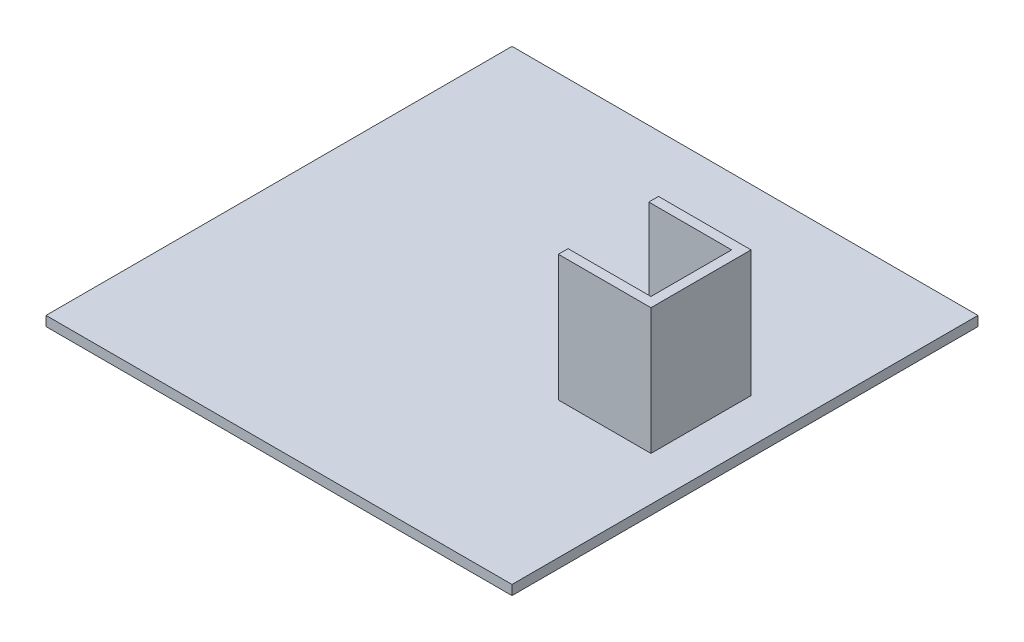
ISO-10303-21;
HEADER;
FILE_DESCRIPTION(('STEP AP214'),'2;1');
FILE_NAME('part.step','',(''),(''),'','','');
FILE_SCHEMA(('AUTOMOTIVE_DESIGN { 1 0 10303 214 1 1 1 1 }'));
ENDSEC;
DATA;
#1=APPLICATION_CONTEXT('core data for automotive mechanical design processes');
#2=APPLICATION_PROTOCOL_DEFINITION('international standard','automotive_design',2000,#1);
#3=PRODUCT_CONTEXT('',#1,'mechanical');
#4=PRODUCT('Part','Part','',(#3));
#5=PRODUCT_RELATED_PRODUCT_CATEGORY('part','',(#4));
#6=PRODUCT_DEFINITION_FORMATION('','',#4);
#7=PRODUCT_DEFINITION_CONTEXT('part definition',#1,'design');
#8=PRODUCT_DEFINITION('design','',#6,#7);
#9=PRODUCT_DEFINITION_SHAPE('','',#8);
#10=(LENGTH_UNIT() NAMED_UNIT(*) SI_UNIT(.MILLI.,.METRE.));
#11=(NAMED_UNIT(*) PLANE_ANGLE_UNIT() SI_UNIT($,.RADIAN.));
#12=(NAMED_UNIT(*) SI_UNIT($,.STERADIAN.) SOLID_ANGLE_UNIT());
#13=UNCERTAINTY_MEASURE_WITH_UNIT(LENGTH_MEASURE(1.E-05),#10,'distance_accuracy_value','');
#14=(GEOMETRIC_REPRESENTATION_CONTEXT(3) GLOBAL_UNCERTAINTY_ASSIGNED_CONTEXT((#13)) GLOBAL_UNIT_ASSIGNED_CONTEXT((#10,
#11,#12)) REPRESENTATION_CONTEXT('',''));
#15=CARTESIAN_POINT('',(0.,0.,0.));
#16=DIRECTION('',(0.,0.,1.));
#17=DIRECTION('',(1.,0.,0.));
#18=AXIS2_PLACEMENT_3D('',#15,#16,#17);
#19=CARTESIAN_POINT('',(76.2,3.175,76.2));
#20=DIRECTION('',(-1.,0.,0.));
#21=DIRECTION('',(0.,0.,1.));
#22=AXIS2_PLACEMENT_3D('',#19,#20,#21);
#23=PLANE('',#22);
#24=DIRECTION('',(0.,0.,-1.));
#25=VECTOR('',#24,1.);
#26=CARTESIAN_POINT('',(76.2,0.,76.2));
#27=LINE('',#26,#25);
#28=CARTESIAN_POINT('',(76.2,0.,76.2));
#29=VERTEX_POINT('',#28);
#30=CARTESIAN_POINT('',(76.2,0.,-76.2));
#31=VERTEX_POINT('',#30);
#32=EDGE_CURVE('E130',#29,#31,#27,.T.);
#33=ORIENTED_EDGE('',*,*,#32,.T.);
#34=DIRECTION('',(0.,-1.,0.));
#35=VECTOR('',#34,1.);
#36=CARTESIAN_POINT('',(76.2,3.175,-76.2));
#37=LINE('',#36,#35);
#38=CARTESIAN_POINT('',(76.2,3.175,-76.2));
#39=VERTEX_POINT('',#38);
#40=EDGE_CURVE('E11',#39,#31,#37,.T.);
#41=ORIENTED_EDGE('',*,*,#40,.F.);
#42=DIRECTION('',(0.,0.,-1.));
#43=VECTOR('',#42,1.);
#44=CARTESIAN_POINT('',(76.2,3.175,76.2));
#45=LINE('',#44,#43);
#46=CARTESIAN_POINT('',(76.2,3.175,76.2));
#47=VERTEX_POINT('',#46);
#48=EDGE_CURVE('E193',#47,#39,#45,.T.);
#49=ORIENTED_EDGE('',*,*,#48,.F.);
#50=DIRECTION('',(0.,-1.,0.));
#51=VECTOR('',#50,1.);
#52=CARTESIAN_POINT('',(76.2,3.175,76.2));
#53=LINE('',#52,#51);
#54=EDGE_CURVE('E203',#47,#29,#53,.T.);
#55=ORIENTED_EDGE('',*,*,#54,.T.);
#56=EDGE_LOOP('',(#33,#41,#49,#55));
#57=FACE_BOUND('',#56,.T.);
#58=ADVANCED_FACE('F35',(#57),#23,.F.);
#59=CARTESIAN_POINT('',(-76.2,3.175,-76.2));
#60=DIRECTION('',(0.,0.,1.));
#61=DIRECTION('',(1.,0.,0.));
#62=AXIS2_PLACEMENT_3D('',#59,#60,#61);
#63=PLANE('',#62);
#64=DIRECTION('',(-1.,0.,0.));
#65=VECTOR('',#64,1.);
#66=CARTESIAN_POINT('',(-76.2,0.,-76.2));
#67=LINE('',#66,#65);
#68=CARTESIAN_POINT('',(-76.2,0.,-76.2));
#69=VERTEX_POINT('',#68);
#70=EDGE_CURVE('E206',#31,#69,#67,.T.);
#71=ORIENTED_EDGE('',*,*,#70,.T.);
#72=DIRECTION('',(0.,-1.,0.));
#73=VECTOR('',#72,1.);
#74=CARTESIAN_POINT('',(-76.2,3.175,-76.2));
#75=LINE('',#74,#73);
#76=CARTESIAN_POINT('',(-76.2,3.175,-76.2));
#77=VERTEX_POINT('',#76);
#78=EDGE_CURVE('E42',#77,#69,#75,.T.);
#79=ORIENTED_EDGE('',*,*,#78,.F.);
#80=DIRECTION('',(-1.,0.,0.));
#81=VECTOR('',#80,1.);
#82=CARTESIAN_POINT('',(-76.2,3.175,-76.2));
#83=LINE('',#82,#81);
#84=EDGE_CURVE('E196',#39,#77,#83,.T.);
#85=ORIENTED_EDGE('',*,*,#84,.F.);
#86=ORIENTED_EDGE('',*,*,#40,.T.);
#87=EDGE_LOOP('',(#71,#79,#85,#86));
#88=FACE_BOUND('',#87,.T.);
#89=ADVANCED_FACE('F236',(#88),#63,.F.);
#90=CARTESIAN_POINT('',(-76.2,3.175,76.2));
#91=DIRECTION('',(1.,0.,0.));
#92=DIRECTION('',(0.,0.,-1.));
#93=AXIS2_PLACEMENT_3D('',#90,#91,#92);
#94=PLANE('',#93);
#95=DIRECTION('',(0.,0.,1.));
#96=VECTOR('',#95,1.);
#97=CARTESIAN_POINT('',(-76.2,0.,76.2));
#98=LINE('',#97,#96);
#99=CARTESIAN_POINT('',(-76.2,0.,76.2));
#100=VERTEX_POINT('',#99);
#101=EDGE_CURVE('E208',#69,#100,#98,.T.);
#102=ORIENTED_EDGE('',*,*,#101,.T.);
#103=DIRECTION('',(0.,-1.,0.));
#104=VECTOR('',#103,1.);
#105=CARTESIAN_POINT('',(-76.2,3.175,76.2));
#106=LINE('',#105,#104);
#107=CARTESIAN_POINT('',(-76.2,3.175,76.2));
#108=VERTEX_POINT('',#107);
#109=EDGE_CURVE('E213',#108,#100,#106,.T.);
#110=ORIENTED_EDGE('',*,*,#109,.F.);
#111=DIRECTION('',(0.,0.,1.));
#112=VECTOR('',#111,1.);
#113=CARTESIAN_POINT('',(-76.2,3.175,76.2));
#114=LINE('',#113,#112);
#115=EDGE_CURVE('E199',#77,#108,#114,.T.);
#116=ORIENTED_EDGE('',*,*,#115,.F.);
#117=ORIENTED_EDGE('',*,*,#78,.T.);
#118=EDGE_LOOP('',(#102,#110,#116,#117));
#119=FACE_BOUND('',#118,.T.);
#120=ADVANCED_FACE('F220',(#119),#94,.F.);
#121=CARTESIAN_POINT('',(-76.2,3.175,76.2));
#122=DIRECTION('',(0.,0.,-1.));
#123=DIRECTION('',(-1.,0.,0.));
#124=AXIS2_PLACEMENT_3D('',#121,#122,#123);
#125=PLANE('',#124);
#126=DIRECTION('',(1.,0.,0.));
#127=VECTOR('',#126,1.);
#128=CARTESIAN_POINT('',(-76.2,0.,76.2));
#129=LINE('',#128,#127);
#130=EDGE_CURVE('E197',#100,#29,#129,.T.);
#131=ORIENTED_EDGE('',*,*,#130,.T.);
#132=ORIENTED_EDGE('',*,*,#54,.F.);
#133=DIRECTION('',(1.,0.,0.));
#134=VECTOR('',#133,1.);
#135=CARTESIAN_POINT('',(-76.2,3.175,76.2));
#136=LINE('',#135,#134);
#137=EDGE_CURVE('E201',#108,#47,#136,.T.);
#138=ORIENTED_EDGE('',*,*,#137,.F.);
#139=ORIENTED_EDGE('',*,*,#109,.T.);
#140=EDGE_LOOP('',(#131,#132,#138,#139));
#141=FACE_BOUND('',#140,.T.);
#142=ADVANCED_FACE('F229',(#141),#125,.F.);
#143=CARTESIAN_POINT('',(0.,3.175,0.));
#144=DIRECTION('',(0.,-1.,0.));
#145=DIRECTION('',(0.,0.,-1.));
#146=AXIS2_PLACEMENT_3D('',#143,#144,#145);
#147=PLANE('',#146);
#148=DIRECTION('',(1.,0.,0.));
#149=VECTOR('',#148,1.);
#150=CARTESIAN_POINT('',(0.,3.175,13.2));
#151=LINE('',#150,#149);
#152=CARTESIAN_POINT('',(31.5354835491299,3.175,13.2));
#153=VERTEX_POINT('',#152);
#154=CARTESIAN_POINT('',(58.6354835491299,3.175,13.2));
#155=VERTEX_POINT('',#154);
#156=EDGE_CURVE('E49',#153,#155,#151,.T.);
#157=ORIENTED_EDGE('',*,*,#156,.T.);
#158=DIRECTION('',(0.,0.,-1.));
#159=VECTOR('',#158,1.);
#160=CARTESIAN_POINT('',(58.6354835491299,3.175,0.));
#161=LINE('',#160,#159);
#162=CARTESIAN_POINT('',(58.6354835491299,3.175,-13.2));
#163=VERTEX_POINT('',#162);
#164=EDGE_CURVE('E127',#155,#163,#161,.T.);
#165=ORIENTED_EDGE('',*,*,#164,.T.);
#166=DIRECTION('',(1.,0.,0.));
#167=VECTOR('',#166,1.);
#168=CARTESIAN_POINT('',(0.,3.175,-13.2));
#169=LINE('',#168,#167);
#170=CARTESIAN_POINT('',(31.5354835491299,3.175,-13.2));
#171=VERTEX_POINT('',#170);
#172=EDGE_CURVE('E141',#171,#163,#169,.T.);
#173=ORIENTED_EDGE('',*,*,#172,.F.);
#174=DIRECTION('',(0.,0.,-1.));
#175=VECTOR('',#174,1.);
#176=CARTESIAN_POINT('',(31.5354835491299,3.175,0.));
#177=LINE('',#176,#175);
#178=CARTESIAN_POINT('',(31.5354835491299,3.175,-16.375));
#179=VERTEX_POINT('',#178);
#180=EDGE_CURVE('E172',#171,#179,#177,.T.);
#181=ORIENTED_EDGE('',*,*,#180,.T.);
#182=DIRECTION('',(1.,0.,0.));
#183=VECTOR('',#182,1.);
#184=CARTESIAN_POINT('',(0.,3.175,-16.375));
#185=LINE('',#184,#183);
#186=CARTESIAN_POINT('',(61.8104835491299,3.175,-16.375));
#187=VERTEX_POINT('',#186);
#188=EDGE_CURVE('E170',#179,#187,#185,.T.);
#189=ORIENTED_EDGE('',*,*,#188,.T.);
#190=DIRECTION('',(0.,0.,-1.));
#191=VECTOR('',#190,1.);
#192=CARTESIAN_POINT('',(61.8104835491299,3.175,0.));
#193=LINE('',#192,#191);
#194=CARTESIAN_POINT('',(61.8104835491299,3.175,16.375));
#195=VERTEX_POINT('',#194);
#196=EDGE_CURVE('E167',#195,#187,#193,.T.);
#197=ORIENTED_EDGE('',*,*,#196,.F.);
#198=DIRECTION('',(1.,0.,0.));
#199=VECTOR('',#198,1.);
#200=CARTESIAN_POINT('',(0.,3.175,16.375));
#201=LINE('',#200,#199);
#202=CARTESIAN_POINT('',(31.5354835491299,3.175,16.375));
#203=VERTEX_POINT('',#202);
#204=EDGE_CURVE('E164',#203,#195,#201,.T.);
#205=ORIENTED_EDGE('',*,*,#204,.F.);
#206=DIRECTION('',(0.,0.,1.));
#207=VECTOR('',#206,1.);
#208=CARTESIAN_POINT('',(31.5354835491299,3.175,0.));
#209=LINE('',#208,#207);
#210=EDGE_CURVE('E54',#153,#203,#209,.T.);
#211=ORIENTED_EDGE('',*,*,#210,.F.);
#212=EDGE_LOOP('',(#157,#165,#173,#181,#189,#197,#205,#211));
#213=FACE_BOUND('',#212,.T.);
#214=ORIENTED_EDGE('',*,*,#48,.T.);
#215=ORIENTED_EDGE('',*,*,#84,.T.);
#216=ORIENTED_EDGE('',*,*,#115,.T.);
#217=ORIENTED_EDGE('',*,*,#137,.T.);
#218=EDGE_LOOP('',(#214,#215,#216,#217));
#219=FACE_BOUND('',#218,.T.);
#220=ADVANCED_FACE('F235',(#213,#219),#147,.F.);
#221=CARTESIAN_POINT('',(0.,0.,0.));
#222=DIRECTION('',(0.,-1.,0.));
#223=DIRECTION('',(0.,0.,-1.));
#224=AXIS2_PLACEMENT_3D('',#221,#222,#223);
#225=PLANE('',#224);
#226=ORIENTED_EDGE('',*,*,#32,.F.);
#227=ORIENTED_EDGE('',*,*,#130,.F.);
#228=ORIENTED_EDGE('',*,*,#101,.F.);
#229=ORIENTED_EDGE('',*,*,#70,.F.);
#230=EDGE_LOOP('',(#226,#227,#228,#229));
#231=FACE_BOUND('',#230,.T.);
#232=ADVANCED_FACE('F226',(#231),#225,.T.);
#233=CARTESIAN_POINT('',(58.6354835491299,44.45,0.));
#234=DIRECTION('',(-1.,0.,0.));
#235=DIRECTION('',(0.,0.,1.));
#236=AXIS2_PLACEMENT_3D('',#233,#234,#235);
#237=PLANE('',#236);
#238=ORIENTED_EDGE('',*,*,#164,.F.);
#239=DIRECTION('',(0.,-1.,0.));
#240=VECTOR('',#239,1.);
#241=CARTESIAN_POINT('',(58.6354835491299,44.45,13.2));
#242=LINE('',#241,#240);
#243=CARTESIAN_POINT('',(58.6354835491299,44.45,13.2));
#244=VERTEX_POINT('',#243);
#245=EDGE_CURVE('E122',#244,#155,#242,.T.);
#246=ORIENTED_EDGE('',*,*,#245,.F.);
#247=DIRECTION('',(0.,0.,-1.));
#248=VECTOR('',#247,1.);
#249=CARTESIAN_POINT('',(58.6354835491299,44.45,0.));
#250=LINE('',#249,#248);
#251=CARTESIAN_POINT('',(58.6354835491299,44.45,-13.2));
#252=VERTEX_POINT('',#251);
#253=EDGE_CURVE('E126',#244,#252,#250,.T.);
#254=ORIENTED_EDGE('',*,*,#253,.T.);
#255=DIRECTION('',(0.,-1.,0.));
#256=VECTOR('',#255,1.);
#257=CARTESIAN_POINT('',(58.6354835491299,44.45,-13.2));
#258=LINE('',#257,#256);
#259=EDGE_CURVE('E160',#252,#163,#258,.T.);
#260=ORIENTED_EDGE('',*,*,#259,.T.);
#261=EDGE_LOOP('',(#238,#246,#254,#260));
#262=FACE_BOUND('',#261,.T.);
#263=ADVANCED_FACE('F124',(#262),#237,.T.);
#264=CARTESIAN_POINT('',(0.,44.45,13.2));
#265=DIRECTION('',(0.,0.,-1.));
#266=DIRECTION('',(-1.,0.,0.));
#267=AXIS2_PLACEMENT_3D('',#264,#265,#266);
#268=PLANE('',#267);
#269=ORIENTED_EDGE('',*,*,#156,.F.);
#270=DIRECTION('',(0.,-1.,0.));
#271=VECTOR('',#270,1.);
#272=CARTESIAN_POINT('',(31.5354835491299,44.45,13.2));
#273=LINE('',#272,#271);
#274=CARTESIAN_POINT('',(31.5354835491299,44.45,13.2));
#275=VERTEX_POINT('',#274);
#276=EDGE_CURVE('E131',#275,#153,#273,.T.);
#277=ORIENTED_EDGE('',*,*,#276,.F.);
#278=DIRECTION('',(1.,0.,0.));
#279=VECTOR('',#278,1.);
#280=CARTESIAN_POINT('',(0.,44.45,13.2));
#281=LINE('',#280,#279);
#282=EDGE_CURVE('E136',#275,#244,#281,.T.);
#283=ORIENTED_EDGE('',*,*,#282,.T.);
#284=ORIENTED_EDGE('',*,*,#245,.T.);
#285=EDGE_LOOP('',(#269,#277,#283,#284));
#286=FACE_BOUND('',#285,.T.);
#287=ADVANCED_FACE('F143',(#286),#268,.T.);
#288=CARTESIAN_POINT('',(31.5354835491299,44.45,0.));
#289=DIRECTION('',(1.,0.,0.));
#290=DIRECTION('',(0.,0.,-1.));
#291=AXIS2_PLACEMENT_3D('',#288,#289,#290);
#292=PLANE('',#291);
#293=ORIENTED_EDGE('',*,*,#210,.T.);
#294=DIRECTION('',(0.,-1.,0.));
#295=VECTOR('',#294,1.);
#296=CARTESIAN_POINT('',(31.5354835491299,44.45,16.375));
#297=LINE('',#296,#295);
#298=CARTESIAN_POINT('',(31.5354835491299,44.45,16.375));
#299=VERTEX_POINT('',#298);
#300=EDGE_CURVE('E189',#299,#203,#297,.T.);
#301=ORIENTED_EDGE('',*,*,#300,.F.);
#302=DIRECTION('',(0.,0.,1.));
#303=VECTOR('',#302,1.);
#304=CARTESIAN_POINT('',(31.5354835491299,44.45,0.));
#305=LINE('',#304,#303);
#306=EDGE_CURVE('E145',#275,#299,#305,.T.);
#307=ORIENTED_EDGE('',*,*,#306,.F.);
#308=ORIENTED_EDGE('',*,*,#276,.T.);
#309=EDGE_LOOP('',(#293,#301,#307,#308));
#310=FACE_BOUND('',#309,.T.);
#311=ADVANCED_FACE('F254',(#310),#292,.F.);
#312=CARTESIAN_POINT('',(0.,44.45,16.375));
#313=DIRECTION('',(0.,0.,-1.));
#314=DIRECTION('',(-1.,0.,0.));
#315=AXIS2_PLACEMENT_3D('',#312,#313,#314);
#316=PLANE('',#315);
#317=ORIENTED_EDGE('',*,*,#204,.T.);
#318=DIRECTION('',(0.,-1.,0.));
#319=VECTOR('',#318,1.);
#320=CARTESIAN_POINT('',(61.8104835491299,44.45,16.375));
#321=LINE('',#320,#319);
#322=CARTESIAN_POINT('',(61.8104835491299,44.45,16.375));
#323=VERTEX_POINT('',#322);
#324=EDGE_CURVE('E186',#323,#195,#321,.T.);
#325=ORIENTED_EDGE('',*,*,#324,.F.);
#326=DIRECTION('',(1.,0.,0.));
#327=VECTOR('',#326,1.);
#328=CARTESIAN_POINT('',(0.,44.45,16.375));
#329=LINE('',#328,#327);
#330=EDGE_CURVE('E147',#299,#323,#329,.T.);
#331=ORIENTED_EDGE('',*,*,#330,.F.);
#332=ORIENTED_EDGE('',*,*,#300,.T.);
#333=EDGE_LOOP('',(#317,#325,#331,#332));
#334=FACE_BOUND('',#333,.T.);
#335=ADVANCED_FACE('F257',(#334),#316,.F.);
#336=CARTESIAN_POINT('',(61.8104835491299,44.45,0.));
#337=DIRECTION('',(-1.,0.,0.));
#338=DIRECTION('',(0.,0.,1.));
#339=AXIS2_PLACEMENT_3D('',#336,#337,#338);
#340=PLANE('',#339);
#341=ORIENTED_EDGE('',*,*,#196,.T.);
#342=DIRECTION('',(0.,-1.,0.));
#343=VECTOR('',#342,1.);
#344=CARTESIAN_POINT('',(61.8104835491299,44.45,-16.375));
#345=LINE('',#344,#343);
#346=CARTESIAN_POINT('',(61.8104835491299,44.45,-16.375));
#347=VERTEX_POINT('',#346);
#348=EDGE_CURVE('E183',#347,#187,#345,.T.);
#349=ORIENTED_EDGE('',*,*,#348,.F.);
#350=DIRECTION('',(0.,0.,-1.));
#351=VECTOR('',#350,1.);
#352=CARTESIAN_POINT('',(61.8104835491299,44.45,0.));
#353=LINE('',#352,#351);
#354=EDGE_CURVE('E151',#323,#347,#353,.T.);
#355=ORIENTED_EDGE('',*,*,#354,.F.);
#356=ORIENTED_EDGE('',*,*,#324,.T.);
#357=EDGE_LOOP('',(#341,#349,#355,#356));
#358=FACE_BOUND('',#357,.T.);
#359=ADVANCED_FACE('F261',(#358),#340,.F.);
#360=CARTESIAN_POINT('',(0.,44.45,-16.375));
#361=DIRECTION('',(0.,0.,-1.));
#362=DIRECTION('',(-1.,0.,0.));
#363=AXIS2_PLACEMENT_3D('',#360,#361,#362);
#364=PLANE('',#363);
#365=ORIENTED_EDGE('',*,*,#188,.F.);
#366=DIRECTION('',(0.,-1.,0.));
#367=VECTOR('',#366,1.);
#368=CARTESIAN_POINT('',(31.5354835491299,44.45,-16.375));
#369=LINE('',#368,#367);
#370=CARTESIAN_POINT('',(31.5354835491299,44.45,-16.375));
#371=VERTEX_POINT('',#370);
#372=EDGE_CURVE('E180',#371,#179,#369,.T.);
#373=ORIENTED_EDGE('',*,*,#372,.F.);
#374=DIRECTION('',(1.,0.,0.));
#375=VECTOR('',#374,1.);
#376=CARTESIAN_POINT('',(0.,44.45,-16.375));
#377=LINE('',#376,#375);
#378=EDGE_CURVE('E153',#371,#347,#377,.T.);
#379=ORIENTED_EDGE('',*,*,#378,.T.);
#380=ORIENTED_EDGE('',*,*,#348,.T.);
#381=EDGE_LOOP('',(#365,#373,#379,#380));
#382=FACE_BOUND('',#381,.T.);
#383=ADVANCED_FACE('F265',(#382),#364,.T.);
#384=CARTESIAN_POINT('',(31.5354835491299,44.45,0.));
#385=DIRECTION('',(-1.,0.,0.));
#386=DIRECTION('',(0.,0.,1.));
#387=AXIS2_PLACEMENT_3D('',#384,#385,#386);
#388=PLANE('',#387);
#389=ORIENTED_EDGE('',*,*,#180,.F.);
#390=DIRECTION('',(0.,-1.,0.));
#391=VECTOR('',#390,1.);
#392=CARTESIAN_POINT('',(31.5354835491299,44.45,-13.2));
#393=LINE('',#392,#391);
#394=CARTESIAN_POINT('',(31.5354835491299,44.45,-13.2));
#395=VERTEX_POINT('',#394);
#396=EDGE_CURVE('E177',#395,#171,#393,.T.);
#397=ORIENTED_EDGE('',*,*,#396,.F.);
#398=DIRECTION('',(0.,0.,-1.));
#399=VECTOR('',#398,1.);
#400=CARTESIAN_POINT('',(31.5354835491299,44.45,0.));
#401=LINE('',#400,#399);
#402=EDGE_CURVE('E156',#395,#371,#401,.T.);
#403=ORIENTED_EDGE('',*,*,#402,.T.);
#404=ORIENTED_EDGE('',*,*,#372,.T.);
#405=EDGE_LOOP('',(#389,#397,#403,#404));
#406=FACE_BOUND('',#405,.T.);
#407=ADVANCED_FACE('F269',(#406),#388,.T.);
#408=CARTESIAN_POINT('',(0.,44.45,-13.2));
#409=DIRECTION('',(0.,0.,-1.));
#410=DIRECTION('',(-1.,0.,0.));
#411=AXIS2_PLACEMENT_3D('',#408,#409,#410);
#412=PLANE('',#411);
#413=ORIENTED_EDGE('',*,*,#172,.T.);
#414=ORIENTED_EDGE('',*,*,#259,.F.);
#415=DIRECTION('',(1.,0.,0.));
#416=VECTOR('',#415,1.);
#417=CARTESIAN_POINT('',(0.,44.45,-13.2));
#418=LINE('',#417,#416);
#419=EDGE_CURVE('E139',#395,#252,#418,.T.);
#420=ORIENTED_EDGE('',*,*,#419,.F.);
#421=ORIENTED_EDGE('',*,*,#396,.T.);
#422=EDGE_LOOP('',(#413,#414,#420,#421));
#423=FACE_BOUND('',#422,.T.);
#424=ADVANCED_FACE('F273',(#423),#412,.F.);
#425=CARTESIAN_POINT('',(0.,44.45,0.));
#426=DIRECTION('',(0.,1.,0.));
#427=DIRECTION('',(0.,0.,1.));
#428=AXIS2_PLACEMENT_3D('',#425,#426,#427);
#429=PLANE('',#428);
#430=ORIENTED_EDGE('',*,*,#253,.F.);
#431=ORIENTED_EDGE('',*,*,#282,.F.);
#432=ORIENTED_EDGE('',*,*,#306,.T.);
#433=ORIENTED_EDGE('',*,*,#330,.T.);
#434=ORIENTED_EDGE('',*,*,#354,.T.);
#435=ORIENTED_EDGE('',*,*,#378,.F.);
#436=ORIENTED_EDGE('',*,*,#402,.F.);
#437=ORIENTED_EDGE('',*,*,#419,.T.);
#438=EDGE_LOOP('',(#430,#431,#432,#433,#434,#435,#436,#437));
#439=FACE_BOUND('',#438,.T.);
#440=ADVANCED_FACE('F135',(#439),#429,.T.);
#441=CLOSED_SHELL('',(#58,#89,#120,#142,#220,#232,#263,#287,#311,#335,#359,#383,#407,#424,#440));
#442=MANIFOLD_SOLID_BREP('B2',#441);
#443=ADVANCED_BREP_SHAPE_REPRESENTATION('',(#18,#442),#14);
#444=SHAPE_DEFINITION_REPRESENTATION(#9,#443);
ENDSEC;
END-ISO-10303-21;
